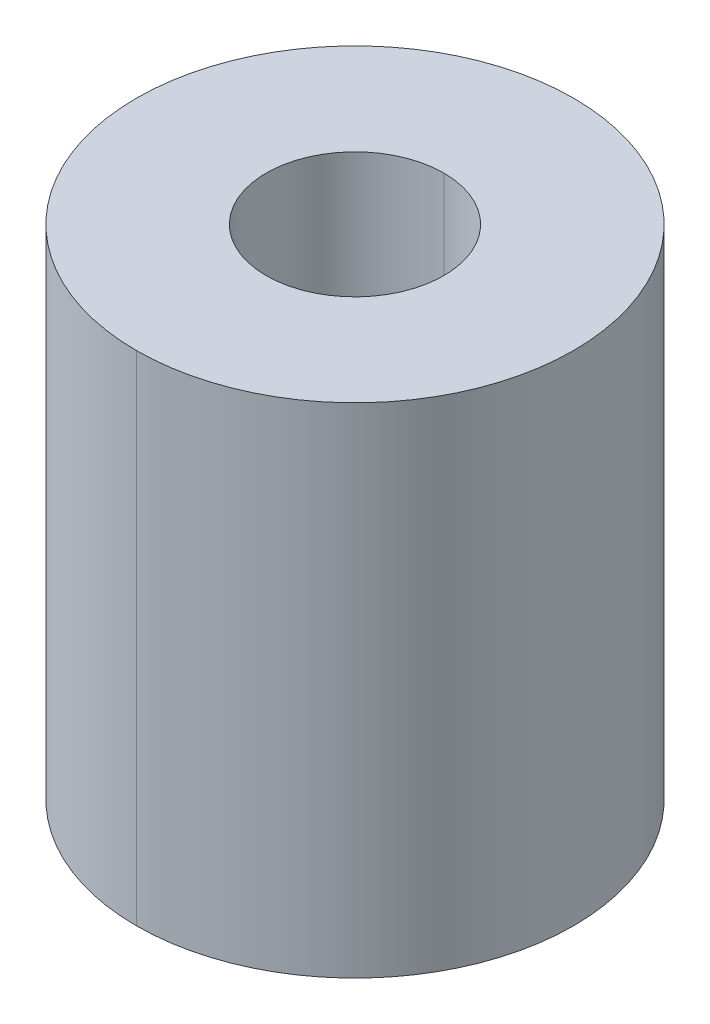
ISO-10303-21;
HEADER;
FILE_DESCRIPTION(('STEP AP214'),'2;1');
FILE_NAME('part.step','',(''),(''),'','','');
FILE_SCHEMA(('AUTOMOTIVE_DESIGN { 1 0 10303 214 1 1 1 1 }'));
ENDSEC;
DATA;
#1=APPLICATION_CONTEXT('core data for automotive mechanical design processes');
#2=APPLICATION_PROTOCOL_DEFINITION('international standard','automotive_design',2000,#1);
#3=PRODUCT_CONTEXT('',#1,'mechanical');
#4=PRODUCT('Part','Part','',(#3));
#5=PRODUCT_RELATED_PRODUCT_CATEGORY('part','',(#4));
#6=PRODUCT_DEFINITION_FORMATION('','',#4);
#7=PRODUCT_DEFINITION_CONTEXT('part definition',#1,'design');
#8=PRODUCT_DEFINITION('design','',#6,#7);
#9=PRODUCT_DEFINITION_SHAPE('','',#8);
#10=(LENGTH_UNIT() NAMED_UNIT(*) SI_UNIT(.MILLI.,.METRE.));
#11=(NAMED_UNIT(*) PLANE_ANGLE_UNIT() SI_UNIT($,.RADIAN.));
#12=(NAMED_UNIT(*) SI_UNIT($,.STERADIAN.) SOLID_ANGLE_UNIT());
#13=UNCERTAINTY_MEASURE_WITH_UNIT(LENGTH_MEASURE(1.E-05),#10,'distance_accuracy_value','');
#14=(GEOMETRIC_REPRESENTATION_CONTEXT(3) GLOBAL_UNCERTAINTY_ASSIGNED_CONTEXT((#13)) GLOBAL_UNIT_ASSIGNED_CONTEXT((#10,
#11,#12)) REPRESENTATION_CONTEXT('',''));
#15=CARTESIAN_POINT('',(0.,0.,0.));
#16=DIRECTION('',(0.,0.,1.));
#17=DIRECTION('',(1.,0.,0.));
#18=AXIS2_PLACEMENT_3D('',#15,#16,#17);
#19=CARTESIAN_POINT('',(0.,0.,0.));
#20=DIRECTION('',(0.,1.,0.));
#21=DIRECTION('',(0.,0.,1.));
#22=AXIS2_PLACEMENT_3D('',#19,#20,#21);
#23=CYLINDRICAL_SURFACE('',#22,1.4224);
#24=DIRECTION('',(0.,1.,0.));
#25=VECTOR('',#24,1.);
#26=CARTESIAN_POINT('',(0.,0.,-1.4224));
#27=LINE('',#26,#25);
#28=CARTESIAN_POINT('',(0.,0.,-1.4224));
#29=VERTEX_POINT('',#28);
#30=CARTESIAN_POINT('',(0.,7.9756,-1.4224));
#31=VERTEX_POINT('',#30);
#32=EDGE_CURVE('E78',#29,#31,#27,.T.);
#33=ORIENTED_EDGE('',*,*,#32,.F.);
#34=CARTESIAN_POINT('',(0.,0.,0.));
#35=DIRECTION('',(0.,1.,0.));
#36=DIRECTION('',(0.,0.,1.));
#37=AXIS2_PLACEMENT_3D('',#34,#35,#36);
#38=CIRCLE('',#37,1.4224);
#39=CARTESIAN_POINT('',(0.,0.,1.4224));
#40=VERTEX_POINT('',#39);
#41=EDGE_CURVE('E11',#40,#29,#38,.T.);
#42=ORIENTED_EDGE('',*,*,#41,.F.);
#43=DIRECTION('',(0.,1.,0.));
#44=VECTOR('',#43,1.);
#45=CARTESIAN_POINT('',(0.,0.,1.4224));
#46=LINE('',#45,#44);
#47=CARTESIAN_POINT('',(0.,7.9756,1.4224));
#48=VERTEX_POINT('',#47);
#49=EDGE_CURVE('E75',#40,#48,#46,.T.);
#50=ORIENTED_EDGE('',*,*,#49,.T.);
#51=CARTESIAN_POINT('',(0.,7.9756,0.));
#52=DIRECTION('',(0.,1.,0.));
#53=DIRECTION('',(0.,0.,1.));
#54=AXIS2_PLACEMENT_3D('',#51,#52,#53);
#55=CIRCLE('',#54,1.4224);
#56=EDGE_CURVE('E27',#48,#31,#55,.T.);
#57=ORIENTED_EDGE('',*,*,#56,.T.);
#58=EDGE_LOOP('',(#33,#42,#50,#57));
#59=FACE_BOUND('',#58,.T.);
#60=ADVANCED_FACE('F16',(#59),#23,.F.);
#61=CARTESIAN_POINT('',(0.,0.,0.));
#62=DIRECTION('',(0.,1.,0.));
#63=DIRECTION('',(1.,0.,0.));
#64=AXIS2_PLACEMENT_3D('',#61,#62,#63);
#65=PLANE('',#64);
#66=ORIENTED_EDGE('',*,*,#41,.T.);
#67=CARTESIAN_POINT('',(0.,0.,0.));
#68=DIRECTION('',(0.,1.,0.));
#69=DIRECTION('',(0.,0.,1.));
#70=AXIS2_PLACEMENT_3D('',#67,#68,#69);
#71=CIRCLE('',#70,1.4224);
#72=EDGE_CURVE('E81',#29,#40,#71,.T.);
#73=ORIENTED_EDGE('',*,*,#72,.T.);
#74=EDGE_LOOP('',(#66,#73));
#75=FACE_BOUND('',#74,.T.);
#76=CARTESIAN_POINT('',(0.,0.,0.));
#77=DIRECTION('',(0.,1.,0.));
#78=DIRECTION('',(0.,0.,1.));
#79=AXIS2_PLACEMENT_3D('',#76,#77,#78);
#80=CIRCLE('',#79,3.49885);
#81=CARTESIAN_POINT('',(0.,0.,-3.49885));
#82=VERTEX_POINT('',#81);
#83=CARTESIAN_POINT('',(0.,0.,3.49885));
#84=VERTEX_POINT('',#83);
#85=EDGE_CURVE('E41',#82,#84,#80,.T.);
#86=ORIENTED_EDGE('',*,*,#85,.F.);
#87=CARTESIAN_POINT('',(0.,0.,0.));
#88=DIRECTION('',(0.,1.,0.));
#89=DIRECTION('',(0.,0.,1.));
#90=AXIS2_PLACEMENT_3D('',#87,#88,#89);
#91=CIRCLE('',#90,3.49885);
#92=EDGE_CURVE('E98',#84,#82,#91,.T.);
#93=ORIENTED_EDGE('',*,*,#92,.F.);
#94=EDGE_LOOP('',(#86,#93));
#95=FACE_BOUND('',#94,.T.);
#96=ADVANCED_FACE('F86',(#75,#95),#65,.F.);
#97=CARTESIAN_POINT('',(0.,7.9756,0.));
#98=DIRECTION('',(0.,1.,0.));
#99=DIRECTION('',(1.,0.,0.));
#100=AXIS2_PLACEMENT_3D('',#97,#98,#99);
#101=PLANE('',#100);
#102=ORIENTED_EDGE('',*,*,#56,.F.);
#103=CARTESIAN_POINT('',(0.,7.9756,0.));
#104=DIRECTION('',(0.,1.,0.));
#105=DIRECTION('',(0.,0.,1.));
#106=AXIS2_PLACEMENT_3D('',#103,#104,#105);
#107=CIRCLE('',#106,1.4224);
#108=EDGE_CURVE('E20',#31,#48,#107,.T.);
#109=ORIENTED_EDGE('',*,*,#108,.F.);
#110=EDGE_LOOP('',(#102,#109));
#111=FACE_BOUND('',#110,.T.);
#112=CARTESIAN_POINT('',(0.,7.9756,0.));
#113=DIRECTION('',(0.,1.,0.));
#114=DIRECTION('',(0.,0.,1.));
#115=AXIS2_PLACEMENT_3D('',#112,#113,#114);
#116=CIRCLE('',#115,3.49885);
#117=CARTESIAN_POINT('',(0.,7.9756,-3.49885));
#118=VERTEX_POINT('',#117);
#119=CARTESIAN_POINT('',(0.,7.9756,3.49885));
#120=VERTEX_POINT('',#119);
#121=EDGE_CURVE('E97',#118,#120,#116,.T.);
#122=ORIENTED_EDGE('',*,*,#121,.T.);
#123=CARTESIAN_POINT('',(0.,7.9756,0.));
#124=DIRECTION('',(0.,1.,0.));
#125=DIRECTION('',(0.,0.,1.));
#126=AXIS2_PLACEMENT_3D('',#123,#124,#125);
#127=CIRCLE('',#126,3.49885);
#128=EDGE_CURVE('E84',#120,#118,#127,.T.);
#129=ORIENTED_EDGE('',*,*,#128,.T.);
#130=EDGE_LOOP('',(#122,#129));
#131=FACE_BOUND('',#130,.T.);
#132=ADVANCED_FACE('F124',(#111,#131),#101,.T.);
#133=CARTESIAN_POINT('',(0.,7.9756,0.));
#134=DIRECTION('',(0.,-1.,0.));
#135=DIRECTION('',(0.,0.,-1.));
#136=AXIS2_PLACEMENT_3D('',#133,#134,#135);
#137=CYLINDRICAL_SURFACE('',#136,3.49885);
#138=DIRECTION('',(0.,-1.,0.));
#139=VECTOR('',#138,1.);
#140=CARTESIAN_POINT('',(0.,7.9756,3.49885));
#141=LINE('',#140,#139);
#142=EDGE_CURVE('E102',#120,#84,#141,.T.);
#143=ORIENTED_EDGE('',*,*,#142,.F.);
#144=ORIENTED_EDGE('',*,*,#121,.F.);
#145=DIRECTION('',(0.,-1.,0.));
#146=VECTOR('',#145,1.);
#147=CARTESIAN_POINT('',(0.,7.9756,-3.49885));
#148=LINE('',#147,#146);
#149=EDGE_CURVE('E94',#118,#82,#148,.T.);
#150=ORIENTED_EDGE('',*,*,#149,.T.);
#151=ORIENTED_EDGE('',*,*,#85,.T.);
#152=EDGE_LOOP('',(#143,#144,#150,#151));
#153=FACE_BOUND('',#152,.T.);
#154=ADVANCED_FACE('F122',(#153),#137,.T.);
#155=CARTESIAN_POINT('',(0.,7.9756,0.));
#156=DIRECTION('',(0.,-1.,0.));
#157=DIRECTION('',(0.,0.,-1.));
#158=AXIS2_PLACEMENT_3D('',#155,#156,#157);
#159=CYLINDRICAL_SURFACE('',#158,3.49885);
#160=ORIENTED_EDGE('',*,*,#128,.F.);
#161=ORIENTED_EDGE('',*,*,#142,.T.);
#162=ORIENTED_EDGE('',*,*,#92,.T.);
#163=ORIENTED_EDGE('',*,*,#149,.F.);
#164=EDGE_LOOP('',(#160,#161,#162,#163));
#165=FACE_BOUND('',#164,.T.);
#166=ADVANCED_FACE('F119',(#165),#159,.T.);
#167=CARTESIAN_POINT('',(0.,0.,0.));
#168=DIRECTION('',(0.,1.,0.));
#169=DIRECTION('',(0.,0.,1.));
#170=AXIS2_PLACEMENT_3D('',#167,#168,#169);
#171=CYLINDRICAL_SURFACE('',#170,1.4224);
#172=ORIENTED_EDGE('',*,*,#72,.F.);
#173=ORIENTED_EDGE('',*,*,#32,.T.);
#174=ORIENTED_EDGE('',*,*,#108,.T.);
#175=ORIENTED_EDGE('',*,*,#49,.F.);
#176=EDGE_LOOP('',(#172,#173,#174,#175));
#177=FACE_BOUND('',#176,.T.);
#178=ADVANCED_FACE('F18',(#177),#171,.F.);
#179=CLOSED_SHELL('',(#60,#96,#132,#154,#166,#178));
#180=MANIFOLD_SOLID_BREP('B1',#179);
#181=ADVANCED_BREP_SHAPE_REPRESENTATION('',(#18,#180),#14);
#182=SHAPE_DEFINITION_REPRESENTATION(#9,#181);
ENDSEC;
END-ISO-10303-21;
